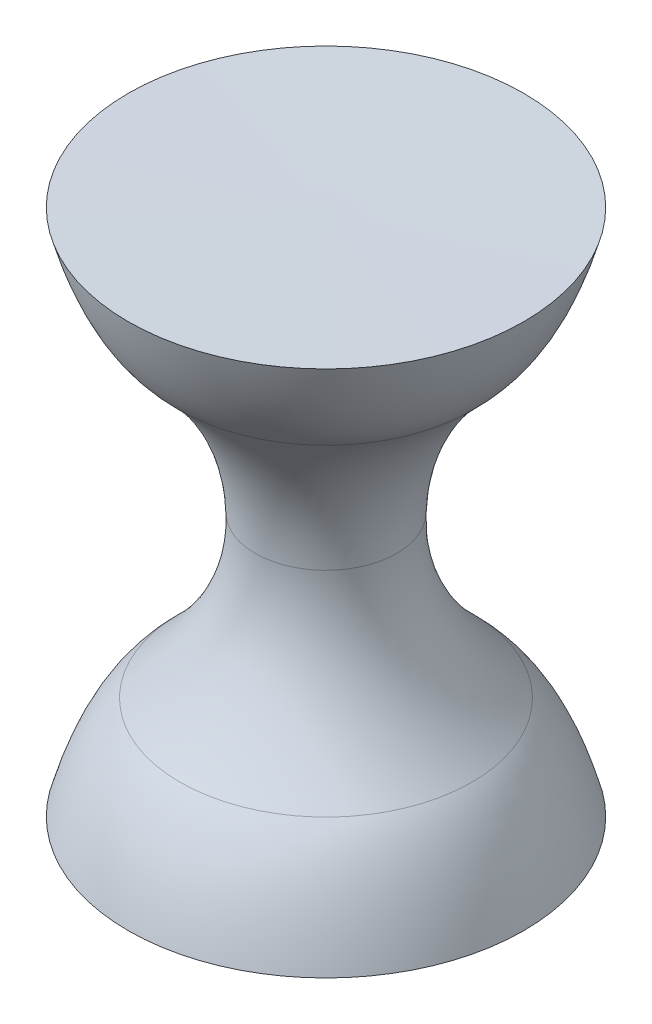
ISO-10303-21;
HEADER;
FILE_DESCRIPTION(('STEP AP214'),'2;1');
FILE_NAME('part.step','',(''),(''),'','','');
FILE_SCHEMA(('AUTOMOTIVE_DESIGN { 1 0 10303 214 1 1 1 1 }'));
ENDSEC;
DATA;
#1=APPLICATION_CONTEXT('core data for automotive mechanical design processes');
#2=APPLICATION_PROTOCOL_DEFINITION('international standard','automotive_design',2000,#1);
#3=PRODUCT_CONTEXT('',#1,'mechanical');
#4=PRODUCT('Part','Part','',(#3));
#5=PRODUCT_RELATED_PRODUCT_CATEGORY('part','',(#4));
#6=PRODUCT_DEFINITION_FORMATION('','',#4);
#7=PRODUCT_DEFINITION_CONTEXT('part definition',#1,'design');
#8=PRODUCT_DEFINITION('design','',#6,#7);
#9=PRODUCT_DEFINITION_SHAPE('','',#8);
#10=(LENGTH_UNIT() NAMED_UNIT(*) SI_UNIT(.MILLI.,.METRE.));
#11=(NAMED_UNIT(*) PLANE_ANGLE_UNIT() SI_UNIT($,.RADIAN.));
#12=(NAMED_UNIT(*) SI_UNIT($,.STERADIAN.) SOLID_ANGLE_UNIT());
#13=UNCERTAINTY_MEASURE_WITH_UNIT(LENGTH_MEASURE(1.E-05),#10,'distance_accuracy_value','');
#14=(GEOMETRIC_REPRESENTATION_CONTEXT(3) GLOBAL_UNCERTAINTY_ASSIGNED_CONTEXT((#13)) GLOBAL_UNIT_ASSIGNED_CONTEXT((#10,
#11,#12)) REPRESENTATION_CONTEXT('',''));
#15=CARTESIAN_POINT('',(0.,0.,0.));
#16=DIRECTION('',(0.,0.,1.));
#17=DIRECTION('',(1.,0.,0.));
#18=AXIS2_PLACEMENT_3D('',#15,#16,#17);
#19=CARTESIAN_POINT('',(5.36667712232926,19.962596541472,0.));
#20=CARTESIAN_POINT('',(5.18777538247857,14.7485521141733,0.));
#21=CARTESIAN_POINT('',(7.84281713847412,10.9282204824361,0.));
#22=CARTESIAN_POINT('',(11.0750764536666,7.79123107734799,0.));
#23=B_SPLINE_CURVE_WITH_KNOTS('',3,(#19,#20,#21,#22),.UNSPECIFIED.,.F.,.F.,(4,4),(0.,
0.821473584216576),.UNSPECIFIED.);
#24=CARTESIAN_POINT('',(0.,39.850386163399,0.));
#25=DIRECTION('',(0.,1.,0.));
#26=AXIS1_PLACEMENT('',#24,#25);
#27=SURFACE_OF_REVOLUTION('',#23,#26);
#28=CARTESIAN_POINT('',(0.,7.79123107734799,0.));
#29=DIRECTION('',(0.,1.,0.));
#30=DIRECTION('',(0.,0.,1.));
#31=AXIS2_PLACEMENT_3D('',#28,#29,#30);
#32=CIRCLE('',#31,11.0750764536666);
#33=CARTESIAN_POINT('',(0.,7.79123107734799,11.0750764536666));
#34=VERTEX_POINT('',#33);
#35=EDGE_CURVE('E11',#34,#34,#32,.T.);
#36=ORIENTED_EDGE('',*,*,#35,.T.);
#37=EDGE_LOOP('',(#36));
#38=FACE_BOUND('',#37,.T.);
#39=CARTESIAN_POINT('',(0.,19.962596541472,0.));
#40=DIRECTION('',(0.,1.,0.));
#41=DIRECTION('',(0.,0.,1.));
#42=AXIS2_PLACEMENT_3D('',#39,#40,#41);
#43=CIRCLE('',#42,5.36667712232926);
#44=CARTESIAN_POINT('',(0.,19.962596541472,5.36667712232926));
#45=VERTEX_POINT('',#44);
#46=EDGE_CURVE('E70',#45,#45,#43,.T.);
#47=ORIENTED_EDGE('',*,*,#46,.F.);
#48=EDGE_LOOP('',(#47));
#49=FACE_BOUND('',#48,.T.);
#50=ADVANCED_FACE('F33',(#38,#49),#27,.F.);
#51=CARTESIAN_POINT('',(15.,0.,0.));
#52=CARTESIAN_POINT('',(13.5017367711369,5.50764288596794,0.));
#53=CARTESIAN_POINT('',(11.0750764536666,7.79123107734799,0.));
#54=B_SPLINE_CURVE_WITH_KNOTS('',2,(#51,#52,#53),.UNSPECIFIED.,.F.,.F.,(3,3),(0.,
0.32355470899662),.UNSPECIFIED.);
#55=CARTESIAN_POINT('',(0.,39.850386163399,0.));
#56=DIRECTION('',(0.,1.,0.));
#57=AXIS1_PLACEMENT('',#55,#56);
#58=SURFACE_OF_REVOLUTION('',#54,#57);
#59=ORIENTED_EDGE('',*,*,#35,.F.);
#60=EDGE_LOOP('',(#59));
#61=FACE_BOUND('',#60,.T.);
#62=CARTESIAN_POINT('',(0.,0.,0.));
#63=DIRECTION('',(0.,1.,0.));
#64=DIRECTION('',(0.,0.,1.));
#65=AXIS2_PLACEMENT_3D('',#62,#63,#64);
#66=CIRCLE('',#65,15.);
#67=CARTESIAN_POINT('',(0.,0.,15.));
#68=VERTEX_POINT('',#67);
#69=EDGE_CURVE('E40',#68,#68,#66,.T.);
#70=ORIENTED_EDGE('',*,*,#69,.T.);
#71=EDGE_LOOP('',(#70));
#72=FACE_BOUND('',#71,.T.);
#73=ADVANCED_FACE('F56',(#61,#72),#58,.T.);
#74=CARTESIAN_POINT('',(0.,0.,0.));
#75=DIRECTION('',(0.,1.,0.));
#76=DIRECTION('',(0.,0.,1.));
#77=AXIS2_PLACEMENT_3D('',#74,#75,#76);
#78=PLANE('',#77);
#79=ORIENTED_EDGE('',*,*,#69,.F.);
#80=EDGE_LOOP('',(#79));
#81=FACE_BOUND('',#80,.T.);
#82=ADVANCED_FACE('F46',(#81),#78,.F.);
#83=CARTESIAN_POINT('',(0.,39.850386163399,0.));
#84=DIRECTION('',(0.,1.,0.));
#85=DIRECTION('',(0.,0.,1.));
#86=AXIS2_PLACEMENT_3D('',#83,#84,#85);
#87=CONICAL_SURFACE('',#86,0.,1.56082239423772);
#88=CARTESIAN_POINT('',(0.,40.0000001134346,0.));
#89=DIRECTION('',(0.,1.,0.));
#90=DIRECTION('',(0.,0.,1.));
#91=AXIS2_PLACEMENT_3D('',#88,#89,#90);
#92=CIRCLE('',#91,15.0000000481135);
#93=CARTESIAN_POINT('',(0.,40.0000001134346,15.0000000481135));
#94=VERTEX_POINT('',#93);
#95=EDGE_CURVE('E75',#94,#94,#92,.T.);
#96=ORIENTED_EDGE('',*,*,#95,.T.);
#97=EDGE_LOOP('',(#96));
#98=FACE_BOUND('',#97,.T.);
#99=CARTESIAN_POINT('',(0.,39.850386163399,0.));
#100=VERTEX_POINT('',#99);
#101=VERTEX_LOOP('',#100);
#102=FACE_BOUND('',#101,.T.);
#103=ADVANCED_FACE('F43',(#98,#102),#87,.F.);
#104=CARTESIAN_POINT('',(15.0000000481135,40.0000001134346,0.));
#105=CARTESIAN_POINT('',(13.5017379848069,34.4923567329928,0.));
#106=CARTESIAN_POINT('',(11.0750776673366,32.2087685416128,0.));
#107=B_SPLINE_CURVE_WITH_KNOTS('',2,(#104,#105,#106),.UNSPECIFIED.,.F.,.F.,(3,3),(0.,
0.32355470899662),.UNSPECIFIED.);
#108=CARTESIAN_POINT('',(0.,39.850386163399,0.));
#109=DIRECTION('',(0.,1.,0.));
#110=AXIS1_PLACEMENT('',#108,#109);
#111=SURFACE_OF_REVOLUTION('',#107,#110);
#112=CARTESIAN_POINT('',(0.,32.2087685416128,0.));
#113=DIRECTION('',(0.,1.,0.));
#114=DIRECTION('',(0.,0.,1.));
#115=AXIS2_PLACEMENT_3D('',#112,#113,#114);
#116=CIRCLE('',#115,11.0750776673366);
#117=CARTESIAN_POINT('',(0.,32.2087685416128,11.0750776673366));
#118=VERTEX_POINT('',#117);
#119=EDGE_CURVE('E72',#118,#118,#116,.T.);
#120=ORIENTED_EDGE('',*,*,#119,.T.);
#121=EDGE_LOOP('',(#120));
#122=FACE_BOUND('',#121,.T.);
#123=ORIENTED_EDGE('',*,*,#95,.F.);
#124=EDGE_LOOP('',(#123));
#125=FACE_BOUND('',#124,.T.);
#126=ADVANCED_FACE('F45',(#122,#125),#111,.F.);
#127=CARTESIAN_POINT('',(5.36667712232926,19.962596541472,0.));
#128=CARTESIAN_POINT('',(5.49316363098727,25.1288557663237,0.));
#129=CARTESIAN_POINT('',(7.84281835214404,29.0717791365247,0.));
#130=CARTESIAN_POINT('',(11.0750776673366,32.2087685416128,0.));
#131=B_SPLINE_CURVE_WITH_KNOTS('',3,(#127,#128,#129,#130),.UNSPECIFIED.,.F.,.F.,(4,4),(0.,
0.821473584216576),.UNSPECIFIED.);
#132=CARTESIAN_POINT('',(0.,39.850386163399,0.));
#133=DIRECTION('',(0.,1.,0.));
#134=AXIS1_PLACEMENT('',#132,#133);
#135=SURFACE_OF_REVOLUTION('',#131,#134);
#136=ORIENTED_EDGE('',*,*,#119,.F.);
#137=EDGE_LOOP('',(#136));
#138=FACE_BOUND('',#137,.T.);
#139=ORIENTED_EDGE('',*,*,#46,.T.);
#140=EDGE_LOOP('',(#139));
#141=FACE_BOUND('',#140,.T.);
#142=ADVANCED_FACE('F53',(#138,#141),#135,.T.);
#143=CLOSED_SHELL('',(#50,#73,#82,#103,#126,#142));
#144=MANIFOLD_SOLID_BREP('B2',#143);
#145=ADVANCED_BREP_SHAPE_REPRESENTATION('',(#18,#144),#14);
#146=SHAPE_DEFINITION_REPRESENTATION(#9,#145);
ENDSEC;
END-ISO-10303-21;
